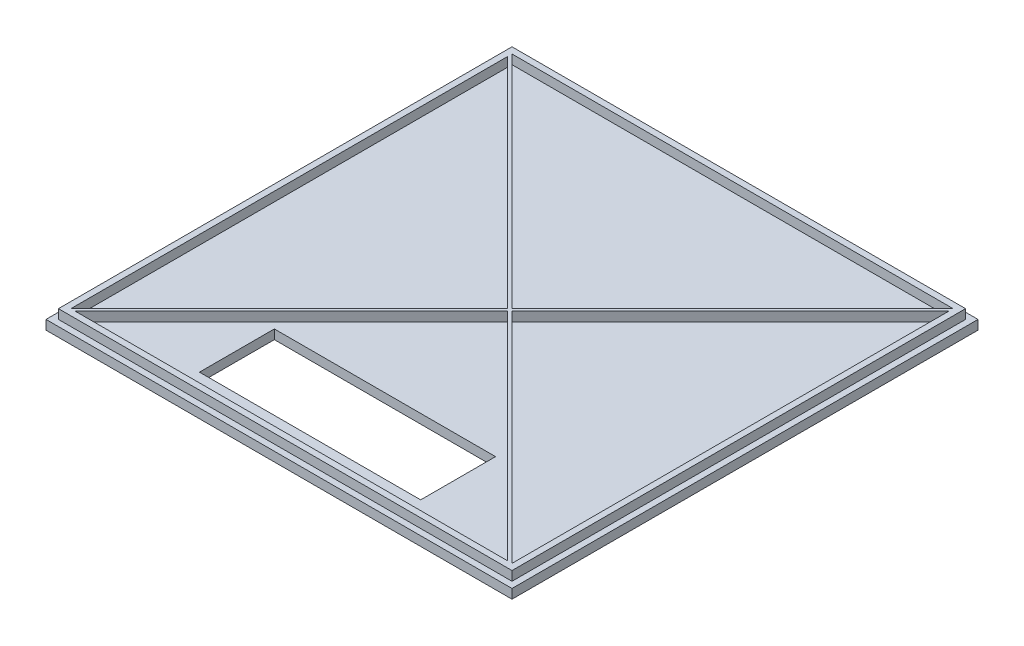
ISO-10303-21;
HEADER;
FILE_DESCRIPTION(('STEP AP214'),'2;1');
FILE_NAME('part.step','',(''),(''),'','','');
FILE_SCHEMA(('AUTOMOTIVE_DESIGN { 1 0 10303 214 1 1 1 1 }'));
ENDSEC;
DATA;
#1=APPLICATION_CONTEXT('core data for automotive mechanical design processes');
#2=APPLICATION_PROTOCOL_DEFINITION('international standard','automotive_design',2000,#1);
#3=PRODUCT_CONTEXT('',#1,'mechanical');
#4=PRODUCT('Part','Part','',(#3));
#5=PRODUCT_RELATED_PRODUCT_CATEGORY('part','',(#4));
#6=PRODUCT_DEFINITION_FORMATION('','',#4);
#7=PRODUCT_DEFINITION_CONTEXT('part definition',#1,'design');
#8=PRODUCT_DEFINITION('design','',#6,#7);
#9=PRODUCT_DEFINITION_SHAPE('','',#8);
#10=(LENGTH_UNIT() NAMED_UNIT(*) SI_UNIT(.MILLI.,.METRE.));
#11=(NAMED_UNIT(*) PLANE_ANGLE_UNIT() SI_UNIT($,.RADIAN.));
#12=(NAMED_UNIT(*) SI_UNIT($,.STERADIAN.) SOLID_ANGLE_UNIT());
#13=UNCERTAINTY_MEASURE_WITH_UNIT(LENGTH_MEASURE(1.E-05),#10,'distance_accuracy_value','');
#14=(GEOMETRIC_REPRESENTATION_CONTEXT(3) GLOBAL_UNCERTAINTY_ASSIGNED_CONTEXT((#13)) GLOBAL_UNIT_ASSIGNED_CONTEXT((#10,
#11,#12)) REPRESENTATION_CONTEXT('',''));
#15=CARTESIAN_POINT('',(0.,0.,0.));
#16=DIRECTION('',(0.,0.,1.));
#17=DIRECTION('',(1.,0.,0.));
#18=AXIS2_PLACEMENT_3D('',#15,#16,#17);
#19=CARTESIAN_POINT('',(71.,203.818325856979,-71.));
#20=DIRECTION('',(-1.,0.,0.));
#21=DIRECTION('',(0.,0.,1.));
#22=AXIS2_PLACEMENT_3D('',#19,#20,#21);
#23=PLANE('',#22);
#24=DIRECTION('',(0.,0.,-1.));
#25=VECTOR('',#24,1.);
#26=CARTESIAN_POINT('',(71.,3.,-71.));
#27=LINE('',#26,#25);
#28=CARTESIAN_POINT('',(71.,3.,71.));
#29=VERTEX_POINT('',#28);
#30=CARTESIAN_POINT('',(71.,3.,-69.5857864376269));
#31=VERTEX_POINT('',#30);
#32=EDGE_CURVE('E327',#29,#31,#27,.T.);
#33=ORIENTED_EDGE('',*,*,#32,.T.);
#34=DIRECTION('',(0.,-1.,0.));
#35=VECTOR('',#34,1.);
#36=CARTESIAN_POINT('',(71.,203.818325856979,-69.5857864376269));
#37=LINE('',#36,#35);
#38=CARTESIAN_POINT('',(71.,0.,-69.5857864376269));
#39=VERTEX_POINT('',#38);
#40=EDGE_CURVE('E291',#31,#39,#37,.T.);
#41=ORIENTED_EDGE('',*,*,#40,.T.);
#42=DIRECTION('',(0.,0.,-1.));
#43=VECTOR('',#42,1.);
#44=CARTESIAN_POINT('',(71.,0.,-71.));
#45=LINE('',#44,#43);
#46=CARTESIAN_POINT('',(71.,0.,71.));
#47=VERTEX_POINT('',#46);
#48=EDGE_CURVE('E317',#47,#39,#45,.T.);
#49=ORIENTED_EDGE('',*,*,#48,.F.);
#50=DIRECTION('',(0.,-1.,0.));
#51=VECTOR('',#50,1.);
#52=CARTESIAN_POINT('',(71.,203.818325856979,71.));
#53=LINE('',#52,#51);
#54=EDGE_CURVE('E303',#29,#47,#53,.T.);
#55=ORIENTED_EDGE('',*,*,#54,.F.);
#56=EDGE_LOOP('',(#33,#41,#49,#55));
#57=FACE_BOUND('',#56,.T.);
#58=ADVANCED_FACE('F59',(#57),#23,.T.);
#59=CARTESIAN_POINT('',(-71.,203.818325856979,-71.));
#60=DIRECTION('',(1.,0.,0.));
#61=DIRECTION('',(0.,0.,-1.));
#62=AXIS2_PLACEMENT_3D('',#59,#60,#61);
#63=PLANE('',#62);
#64=DIRECTION('',(0.,0.,1.));
#65=VECTOR('',#64,1.);
#66=CARTESIAN_POINT('',(-71.,0.,-71.));
#67=LINE('',#66,#65);
#68=CARTESIAN_POINT('',(-71.,0.,-69.5857864376269));
#69=VERTEX_POINT('',#68);
#70=CARTESIAN_POINT('',(-71.,0.,71.));
#71=VERTEX_POINT('',#70);
#72=EDGE_CURVE('E309',#69,#71,#67,.T.);
#73=ORIENTED_EDGE('',*,*,#72,.F.);
#74=DIRECTION('',(0.,1.,0.));
#75=VECTOR('',#74,1.);
#76=CARTESIAN_POINT('',(-71.,203.818325856979,-69.5857864376269));
#77=LINE('',#76,#75);
#78=CARTESIAN_POINT('',(-71.,3.,-69.5857864376269));
#79=VERTEX_POINT('',#78);
#80=EDGE_CURVE('E297',#69,#79,#77,.T.);
#81=ORIENTED_EDGE('',*,*,#80,.T.);
#82=DIRECTION('',(0.,0.,1.));
#83=VECTOR('',#82,1.);
#84=CARTESIAN_POINT('',(-71.,3.,-71.));
#85=LINE('',#84,#83);
#86=CARTESIAN_POINT('',(-71.,3.00000000000006,71.));
#87=VERTEX_POINT('',#86);
#88=EDGE_CURVE('E320',#79,#87,#85,.T.);
#89=ORIENTED_EDGE('',*,*,#88,.T.);
#90=DIRECTION('',(0.,-1.,0.));
#91=VECTOR('',#90,1.);
#92=CARTESIAN_POINT('',(-71.,203.818325856979,71.));
#93=LINE('',#92,#91);
#94=EDGE_CURVE('E308',#87,#71,#93,.T.);
#95=ORIENTED_EDGE('',*,*,#94,.T.);
#96=EDGE_LOOP('',(#73,#81,#89,#95));
#97=FACE_BOUND('',#96,.T.);
#98=ADVANCED_FACE('F432',(#97),#63,.T.);
#99=CARTESIAN_POINT('',(-71.,203.818325856979,71.));
#100=DIRECTION('',(0.,0.,-1.));
#101=DIRECTION('',(-1.,0.,0.));
#102=AXIS2_PLACEMENT_3D('',#99,#100,#101);
#103=PLANE('',#102);
#104=DIRECTION('',(1.,0.,0.));
#105=VECTOR('',#104,1.);
#106=CARTESIAN_POINT('',(-71.,3.,71.));
#107=LINE('',#106,#105);
#108=CARTESIAN_POINT('',(-69.5857864376269,3.,71.));
#109=VERTEX_POINT('',#108);
#110=CARTESIAN_POINT('',(69.5857864376269,3.,71.));
#111=VERTEX_POINT('',#110);
#112=EDGE_CURVE('E307',#109,#111,#107,.T.);
#113=ORIENTED_EDGE('',*,*,#112,.T.);
#114=DIRECTION('',(0.,-1.,0.));
#115=VECTOR('',#114,1.);
#116=CARTESIAN_POINT('',(69.5857864376269,203.818325856979,71.));
#117=LINE('',#116,#115);
#118=CARTESIAN_POINT('',(69.5857864376269,0.,71.));
#119=VERTEX_POINT('',#118);
#120=EDGE_CURVE('E300',#111,#119,#117,.T.);
#121=ORIENTED_EDGE('',*,*,#120,.T.);
#122=DIRECTION('',(1.,0.,0.));
#123=VECTOR('',#122,1.);
#124=CARTESIAN_POINT('',(-71.,0.,71.));
#125=LINE('',#124,#123);
#126=CARTESIAN_POINT('',(-69.5857864376269,0.,71.));
#127=VERTEX_POINT('',#126);
#128=EDGE_CURVE('E304',#127,#119,#125,.T.);
#129=ORIENTED_EDGE('',*,*,#128,.F.);
#130=DIRECTION('',(0.,1.,0.));
#131=VECTOR('',#130,1.);
#132=CARTESIAN_POINT('',(-69.5857864376269,203.818325856979,71.));
#133=LINE('',#132,#131);
#134=EDGE_CURVE('E294',#127,#109,#133,.T.);
#135=ORIENTED_EDGE('',*,*,#134,.T.);
#136=EDGE_LOOP('',(#113,#121,#129,#135));
#137=FACE_BOUND('',#136,.T.);
#138=ADVANCED_FACE('F405',(#137),#103,.T.);
#139=CARTESIAN_POINT('',(0.,0.,0.));
#140=DIRECTION('',(0.,1.,0.));
#141=DIRECTION('',(0.,0.,1.));
#142=AXIS2_PLACEMENT_3D('',#139,#140,#141);
#143=PLANE('',#142);
#144=DIRECTION('',(0.707106781186547,0.,-0.707106781186548));
#145=VECTOR('',#144,1.);
#146=CARTESIAN_POINT('',(-71.,0.,71.));
#147=LINE('',#146,#145);
#148=CARTESIAN_POINT('',(-0.707106781186531,0.,0.707106781186573));
#149=VERTEX_POINT('',#148);
#150=EDGE_CURVE('E255',#71,#149,#147,.T.);
#151=ORIENTED_EDGE('',*,*,#150,.T.);
#152=DIRECTION('',(-0.707106781186548,0.,-0.707106781186548));
#153=VECTOR('',#152,1.);
#154=CARTESIAN_POINT('',(-0.707106781186553,0.,0.707106781186553));
#155=LINE('',#154,#153);
#156=EDGE_CURVE('E12',#149,#69,#155,.T.);
#157=ORIENTED_EDGE('',*,*,#156,.T.);
#158=ORIENTED_EDGE('',*,*,#72,.T.);
#159=EDGE_LOOP('',(#151,#157,#158));
#160=FACE_BOUND('',#159,.T.);
#161=ADVANCED_FACE('F559',(#160),#143,.T.);
#162=DIRECTION('',(0.,0.,-1.));
#163=VECTOR('',#162,1.);
#164=CARTESIAN_POINT('',(35.5999999999999,0.,0.));
#165=LINE('',#164,#163);
#166=CARTESIAN_POINT('',(35.5999999999999,0.,65.));
#167=VERTEX_POINT('',#166);
#168=CARTESIAN_POINT('',(35.5999999999999,0.,40.9));
#169=VERTEX_POINT('',#168);
#170=EDGE_CURVE('E230',#167,#169,#165,.T.);
#171=ORIENTED_EDGE('',*,*,#170,.F.);
#172=DIRECTION('',(1.,0.,0.));
#173=VECTOR('',#172,1.);
#174=CARTESIAN_POINT('',(0.,0.,65.));
#175=LINE('',#174,#173);
#176=CARTESIAN_POINT('',(-35.6000000000001,0.,65.));
#177=VERTEX_POINT('',#176);
#178=EDGE_CURVE('E251',#177,#167,#175,.T.);
#179=ORIENTED_EDGE('',*,*,#178,.F.);
#180=DIRECTION('',(0.,0.,1.));
#181=VECTOR('',#180,1.);
#182=CARTESIAN_POINT('',(-35.6000000000001,0.,0.));
#183=LINE('',#182,#181);
#184=CARTESIAN_POINT('',(-35.6000000000001,0.,40.9));
#185=VERTEX_POINT('',#184);
#186=EDGE_CURVE('E249',#185,#177,#183,.T.);
#187=ORIENTED_EDGE('',*,*,#186,.F.);
#188=DIRECTION('',(-1.,0.,0.));
#189=VECTOR('',#188,1.);
#190=CARTESIAN_POINT('',(0.,0.,40.9));
#191=LINE('',#190,#189);
#192=EDGE_CURVE('E222',#169,#185,#191,.T.);
#193=ORIENTED_EDGE('',*,*,#192,.F.);
#194=EDGE_LOOP('',(#171,#179,#187,#193));
#195=FACE_BOUND('',#194,.T.);
#196=ORIENTED_EDGE('',*,*,#128,.T.);
#197=DIRECTION('',(0.707106781186548,0.,0.707106781186548));
#198=VECTOR('',#197,1.);
#199=CARTESIAN_POINT('',(-71.7071067811866,0.,-70.2928932188134));
#200=LINE('',#199,#198);
#201=CARTESIAN_POINT('',(0.,0.,1.4142135623731));
#202=VERTEX_POINT('',#201);
#203=EDGE_CURVE('E278',#202,#119,#200,.T.);
#204=ORIENTED_EDGE('',*,*,#203,.F.);
#205=DIRECTION('',(-0.707106781186547,0.,0.707106781186548));
#206=VECTOR('',#205,1.);
#207=CARTESIAN_POINT('',(0.707106781186538,0.,0.707106781186538));
#208=LINE('',#207,#206);
#209=EDGE_CURVE('E67',#202,#127,#208,.T.);
#210=ORIENTED_EDGE('',*,*,#209,.T.);
#211=EDGE_LOOP('',(#196,#204,#210));
#212=FACE_BOUND('',#211,.T.);
#213=ADVANCED_FACE('F401',(#195,#212),#143,.T.);
#214=DIRECTION('',(0.707106781186548,0.,0.707106781186548));
#215=VECTOR('',#214,1.);
#216=CARTESIAN_POINT('',(-71.,0.,-71.));
#217=LINE('',#216,#215);
#218=CARTESIAN_POINT('',(-71.,0.,-71.));
#219=VERTEX_POINT('',#218);
#220=CARTESIAN_POINT('',(0.,0.,0.));
#221=VERTEX_POINT('',#220);
#222=EDGE_CURVE('E273',#219,#221,#217,.T.);
#223=ORIENTED_EDGE('',*,*,#222,.T.);
#224=CARTESIAN_POINT('',(71.,0.,-71.));
#225=VERTEX_POINT('',#224);
#226=EDGE_CURVE('E259',#221,#225,#147,.T.);
#227=ORIENTED_EDGE('',*,*,#226,.T.);
#228=DIRECTION('',(-1.,0.,0.));
#229=VECTOR('',#228,1.);
#230=CARTESIAN_POINT('',(-71.,0.,-71.));
#231=LINE('',#230,#229);
#232=EDGE_CURVE('E313',#225,#219,#231,.T.);
#233=ORIENTED_EDGE('',*,*,#232,.T.);
#234=EDGE_LOOP('',(#223,#227,#233));
#235=FACE_BOUND('',#234,.T.);
#236=ADVANCED_FACE('F446',(#235),#143,.T.);
#237=CARTESIAN_POINT('',(0.,3.,0.));
#238=DIRECTION('',(0.,1.,0.));
#239=DIRECTION('',(0.,0.,1.));
#240=AXIS2_PLACEMENT_3D('',#237,#238,#239);
#241=PLANE('',#240);
#242=DIRECTION('',(0.707106781186548,0.,0.707106781186548));
#243=VECTOR('',#242,1.);
#244=CARTESIAN_POINT('',(-71.7071067811866,3.,-70.2928932188134));
#245=LINE('',#244,#243);
#246=CARTESIAN_POINT('',(0.,3.,1.4142135623731));
#247=VERTEX_POINT('',#246);
#248=EDGE_CURVE('E272',#247,#111,#245,.T.);
#249=ORIENTED_EDGE('',*,*,#248,.T.);
#250=ORIENTED_EDGE('',*,*,#112,.F.);
#251=DIRECTION('',(0.707106781186547,0.,-0.707106781186548));
#252=VECTOR('',#251,1.);
#253=CARTESIAN_POINT('',(-70.2928932188134,3.,71.7071067811865));
#254=LINE('',#253,#252);
#255=EDGE_CURVE('E264',#109,#247,#254,.T.);
#256=ORIENTED_EDGE('',*,*,#255,.T.);
#257=EDGE_LOOP('',(#249,#250,#256));
#258=FACE_BOUND('',#257,.T.);
#259=ORIENTED_EDGE('',*,*,#32,.F.);
#260=DIRECTION('',(0.707106781186548,0.,0.707106781186548));
#261=VECTOR('',#260,1.);
#262=CARTESIAN_POINT('',(-71.,3.,-71.));
#263=LINE('',#262,#261);
#264=CARTESIAN_POINT('',(0.707106781186559,3.,0.707106781186573));
#265=VERTEX_POINT('',#264);
#266=EDGE_CURVE('E276',#265,#29,#263,.T.);
#267=ORIENTED_EDGE('',*,*,#266,.F.);
#268=EDGE_CURVE('E254',#265,#31,#254,.T.);
#269=ORIENTED_EDGE('',*,*,#268,.T.);
#270=EDGE_LOOP('',(#259,#267,#269));
#271=FACE_BOUND('',#270,.T.);
#272=CARTESIAN_POINT('',(-71.,3.00000000000006,-71.));
#273=VERTEX_POINT('',#272);
#274=CARTESIAN_POINT('',(0.,3.,0.));
#275=VERTEX_POINT('',#274);
#276=EDGE_CURVE('E281',#273,#275,#263,.T.);
#277=ORIENTED_EDGE('',*,*,#276,.F.);
#278=DIRECTION('',(-1.,0.,0.));
#279=VECTOR('',#278,1.);
#280=CARTESIAN_POINT('',(-71.,3.,-71.));
#281=LINE('',#280,#279);
#282=CARTESIAN_POINT('',(71.,3.,-71.));
#283=VERTEX_POINT('',#282);
#284=EDGE_CURVE('E324',#283,#273,#281,.T.);
#285=ORIENTED_EDGE('',*,*,#284,.F.);
#286=DIRECTION('',(0.707106781186547,0.,-0.707106781186548));
#287=VECTOR('',#286,1.);
#288=CARTESIAN_POINT('',(-71.,3.,71.));
#289=LINE('',#288,#287);
#290=EDGE_CURVE('E258',#275,#283,#289,.T.);
#291=ORIENTED_EDGE('',*,*,#290,.F.);
#292=EDGE_LOOP('',(#277,#285,#291));
#293=FACE_BOUND('',#292,.T.);
#294=CARTESIAN_POINT('',(-0.707106781186531,3.,0.707106781186573));
#295=VERTEX_POINT('',#294);
#296=EDGE_CURVE('E263',#87,#295,#289,.T.);
#297=ORIENTED_EDGE('',*,*,#296,.F.);
#298=ORIENTED_EDGE('',*,*,#88,.F.);
#299=EDGE_CURVE('E282',#79,#295,#245,.T.);
#300=ORIENTED_EDGE('',*,*,#299,.T.);
#301=EDGE_LOOP('',(#297,#298,#300));
#302=FACE_BOUND('',#301,.T.);
#303=DIRECTION('',(0.,0.,-1.));
#304=VECTOR('',#303,1.);
#305=CARTESIAN_POINT('',(73.,3.,-73.));
#306=LINE('',#305,#304);
#307=CARTESIAN_POINT('',(73.,3.,73.));
#308=VERTEX_POINT('',#307);
#309=CARTESIAN_POINT('',(73.,3.,-73.));
#310=VERTEX_POINT('',#309);
#311=EDGE_CURVE('E338',#308,#310,#306,.T.);
#312=ORIENTED_EDGE('',*,*,#311,.T.);
#313=DIRECTION('',(-1.,0.,0.));
#314=VECTOR('',#313,1.);
#315=CARTESIAN_POINT('',(-73.,3.,-73.));
#316=LINE('',#315,#314);
#317=CARTESIAN_POINT('',(-73.,3.,-73.));
#318=VERTEX_POINT('',#317);
#319=EDGE_CURVE('E341',#310,#318,#316,.T.);
#320=ORIENTED_EDGE('',*,*,#319,.T.);
#321=DIRECTION('',(0.,0.,1.));
#322=VECTOR('',#321,1.);
#323=CARTESIAN_POINT('',(-73.,3.,-73.));
#324=LINE('',#323,#322);
#325=CARTESIAN_POINT('',(-73.,3.,73.));
#326=VERTEX_POINT('',#325);
#327=EDGE_CURVE('E344',#318,#326,#324,.T.);
#328=ORIENTED_EDGE('',*,*,#327,.T.);
#329=DIRECTION('',(1.,0.,0.));
#330=VECTOR('',#329,1.);
#331=CARTESIAN_POINT('',(-73.,3.,73.));
#332=LINE('',#331,#330);
#333=EDGE_CURVE('E346',#326,#308,#332,.T.);
#334=ORIENTED_EDGE('',*,*,#333,.T.);
#335=EDGE_LOOP('',(#312,#320,#328,#334));
#336=FACE_BOUND('',#335,.T.);
#337=ADVANCED_FACE('F412',(#258,#271,#293,#302,#336),#241,.T.);
#338=CARTESIAN_POINT('',(0.,0.,0.));
#339=DIRECTION('',(0.,1.,0.));
#340=DIRECTION('',(0.,0.,1.));
#341=AXIS2_PLACEMENT_3D('',#338,#339,#340);
#342=PLANE('',#341);
#343=DIRECTION('',(0.,0.,-1.));
#344=VECTOR('',#343,1.);
#345=CARTESIAN_POINT('',(74.9999999999999,0.,-75.));
#346=LINE('',#345,#344);
#347=CARTESIAN_POINT('',(74.9999999999999,0.,75.));
#348=VERTEX_POINT('',#347);
#349=CARTESIAN_POINT('',(74.9999999999999,0.,-75.));
#350=VERTEX_POINT('',#349);
#351=EDGE_CURVE('E366',#348,#350,#346,.T.);
#352=ORIENTED_EDGE('',*,*,#351,.T.);
#353=DIRECTION('',(-1.,0.,0.));
#354=VECTOR('',#353,1.);
#355=CARTESIAN_POINT('',(-75.0000000000001,0.,-75.));
#356=LINE('',#355,#354);
#357=CARTESIAN_POINT('',(-75.0000000000001,0.,-75.));
#358=VERTEX_POINT('',#357);
#359=EDGE_CURVE('E383',#350,#358,#356,.T.);
#360=ORIENTED_EDGE('',*,*,#359,.T.);
#361=DIRECTION('',(0.,0.,1.));
#362=VECTOR('',#361,1.);
#363=CARTESIAN_POINT('',(-75.0000000000001,0.,-75.));
#364=LINE('',#363,#362);
#365=CARTESIAN_POINT('',(-75.,0.,75.));
#366=VERTEX_POINT('',#365);
#367=EDGE_CURVE('E386',#358,#366,#364,.T.);
#368=ORIENTED_EDGE('',*,*,#367,.T.);
#369=DIRECTION('',(1.,0.,0.));
#370=VECTOR('',#369,1.);
#371=CARTESIAN_POINT('',(-75.,0.,75.));
#372=LINE('',#371,#370);
#373=EDGE_CURVE('E371',#366,#348,#372,.T.);
#374=ORIENTED_EDGE('',*,*,#373,.T.);
#375=EDGE_LOOP('',(#352,#360,#368,#374));
#376=FACE_BOUND('',#375,.T.);
#377=DIRECTION('',(-1.,0.,0.));
#378=VECTOR('',#377,1.);
#379=CARTESIAN_POINT('',(-73.,0.,-73.));
#380=LINE('',#379,#378);
#381=CARTESIAN_POINT('',(73.,0.,-73.));
#382=VERTEX_POINT('',#381);
#383=CARTESIAN_POINT('',(-73.,0.,-73.));
#384=VERTEX_POINT('',#383);
#385=EDGE_CURVE('E351',#382,#384,#380,.T.);
#386=ORIENTED_EDGE('',*,*,#385,.F.);
#387=DIRECTION('',(0.,0.,-1.));
#388=VECTOR('',#387,1.);
#389=CARTESIAN_POINT('',(73.,0.,-73.));
#390=LINE('',#389,#388);
#391=CARTESIAN_POINT('',(73.,0.,73.));
#392=VERTEX_POINT('',#391);
#393=EDGE_CURVE('E323',#392,#382,#390,.T.);
#394=ORIENTED_EDGE('',*,*,#393,.F.);
#395=DIRECTION('',(1.,0.,0.));
#396=VECTOR('',#395,1.);
#397=CARTESIAN_POINT('',(-73.,0.,73.));
#398=LINE('',#397,#396);
#399=CARTESIAN_POINT('',(-73.,0.,73.));
#400=VERTEX_POINT('',#399);
#401=EDGE_CURVE('E342',#400,#392,#398,.T.);
#402=ORIENTED_EDGE('',*,*,#401,.F.);
#403=DIRECTION('',(0.,0.,1.));
#404=VECTOR('',#403,1.);
#405=CARTESIAN_POINT('',(-73.,0.,-73.));
#406=LINE('',#405,#404);
#407=EDGE_CURVE('E353',#384,#400,#406,.T.);
#408=ORIENTED_EDGE('',*,*,#407,.F.);
#409=EDGE_LOOP('',(#386,#394,#402,#408));
#410=FACE_BOUND('',#409,.T.);
#411=ADVANCED_FACE('F445',(#376,#410),#342,.T.);
#412=CARTESIAN_POINT('',(74.9999999999999,-3.,-75.));
#413=DIRECTION('',(1.,0.,0.));
#414=DIRECTION('',(0.,0.,-1.));
#415=AXIS2_PLACEMENT_3D('',#412,#413,#414);
#416=PLANE('',#415);
#417=ORIENTED_EDGE('',*,*,#351,.F.);
#418=DIRECTION('',(0.,1.,0.));
#419=VECTOR('',#418,1.);
#420=CARTESIAN_POINT('',(74.9999999999999,-3.,75.));
#421=LINE('',#420,#419);
#422=CARTESIAN_POINT('',(74.9999999999999,-3.,75.));
#423=VERTEX_POINT('',#422);
#424=EDGE_CURVE('E391',#423,#348,#421,.T.);
#425=ORIENTED_EDGE('',*,*,#424,.F.);
#426=DIRECTION('',(0.,0.,-1.));
#427=VECTOR('',#426,1.);
#428=CARTESIAN_POINT('',(74.9999999999999,-3.,-75.));
#429=LINE('',#428,#427);
#430=CARTESIAN_POINT('',(74.9999999999999,-3.,-75.));
#431=VERTEX_POINT('',#430);
#432=EDGE_CURVE('E367',#423,#431,#429,.T.);
#433=ORIENTED_EDGE('',*,*,#432,.T.);
#434=DIRECTION('',(0.,1.,0.));
#435=VECTOR('',#434,1.);
#436=CARTESIAN_POINT('',(74.9999999999999,-3.,-75.));
#437=LINE('',#436,#435);
#438=EDGE_CURVE('E380',#431,#350,#437,.T.);
#439=ORIENTED_EDGE('',*,*,#438,.T.);
#440=EDGE_LOOP('',(#417,#425,#433,#439));
#441=FACE_BOUND('',#440,.T.);
#442=ADVANCED_FACE('F61',(#441),#416,.T.);
#443=CARTESIAN_POINT('',(-75.,-3.,75.));
#444=DIRECTION('',(0.,0.,1.));
#445=DIRECTION('',(1.,0.,0.));
#446=AXIS2_PLACEMENT_3D('',#443,#444,#445);
#447=PLANE('',#446);
#448=ORIENTED_EDGE('',*,*,#373,.F.);
#449=DIRECTION('',(0.,1.,0.));
#450=VECTOR('',#449,1.);
#451=CARTESIAN_POINT('',(-75.,-3.,75.));
#452=LINE('',#451,#450);
#453=CARTESIAN_POINT('',(-75.,-3.,75.));
#454=VERTEX_POINT('',#453);
#455=EDGE_CURVE('E393',#454,#366,#452,.T.);
#456=ORIENTED_EDGE('',*,*,#455,.F.);
#457=DIRECTION('',(1.,0.,0.));
#458=VECTOR('',#457,1.);
#459=CARTESIAN_POINT('',(-75.,-3.,75.));
#460=LINE('',#459,#458);
#461=EDGE_CURVE('E377',#454,#423,#460,.T.);
#462=ORIENTED_EDGE('',*,*,#461,.T.);
#463=ORIENTED_EDGE('',*,*,#424,.T.);
#464=EDGE_LOOP('',(#448,#456,#462,#463));
#465=FACE_BOUND('',#464,.T.);
#466=ADVANCED_FACE('F469',(#465),#447,.T.);
#467=CARTESIAN_POINT('',(-75.0000000000001,-3.,-75.));
#468=DIRECTION('',(-1.,0.,0.));
#469=DIRECTION('',(0.,0.,1.));
#470=AXIS2_PLACEMENT_3D('',#467,#468,#469);
#471=PLANE('',#470);
#472=ORIENTED_EDGE('',*,*,#367,.F.);
#473=DIRECTION('',(0.,1.,0.));
#474=VECTOR('',#473,1.);
#475=CARTESIAN_POINT('',(-75.0000000000001,-3.,-75.));
#476=LINE('',#475,#474);
#477=CARTESIAN_POINT('',(-75.0000000000001,-3.,-75.));
#478=VERTEX_POINT('',#477);
#479=EDGE_CURVE('E395',#478,#358,#476,.T.);
#480=ORIENTED_EDGE('',*,*,#479,.F.);
#481=DIRECTION('',(0.,0.,1.));
#482=VECTOR('',#481,1.);
#483=CARTESIAN_POINT('',(-75.0000000000001,-3.,-75.));
#484=LINE('',#483,#482);
#485=EDGE_CURVE('E374',#478,#454,#484,.T.);
#486=ORIENTED_EDGE('',*,*,#485,.T.);
#487=ORIENTED_EDGE('',*,*,#455,.T.);
#488=EDGE_LOOP('',(#472,#480,#486,#487));
#489=FACE_BOUND('',#488,.T.);
#490=ADVANCED_FACE('F472',(#489),#471,.T.);
#491=CARTESIAN_POINT('',(-75.0000000000001,-3.,-75.));
#492=DIRECTION('',(0.,0.,-1.));
#493=DIRECTION('',(-1.,0.,0.));
#494=AXIS2_PLACEMENT_3D('',#491,#492,#493);
#495=PLANE('',#494);
#496=ORIENTED_EDGE('',*,*,#359,.F.);
#497=ORIENTED_EDGE('',*,*,#438,.F.);
#498=DIRECTION('',(-1.,0.,0.));
#499=VECTOR('',#498,1.);
#500=CARTESIAN_POINT('',(-75.0000000000001,-3.,-75.));
#501=LINE('',#500,#499);
#502=EDGE_CURVE('E370',#431,#478,#501,.T.);
#503=ORIENTED_EDGE('',*,*,#502,.T.);
#504=ORIENTED_EDGE('',*,*,#479,.T.);
#505=EDGE_LOOP('',(#496,#497,#503,#504));
#506=FACE_BOUND('',#505,.T.);
#507=ADVANCED_FACE('F465',(#506),#495,.T.);
#508=CARTESIAN_POINT('',(0.,-3.,0.));
#509=DIRECTION('',(0.,1.,0.));
#510=DIRECTION('',(0.,0.,1.));
#511=AXIS2_PLACEMENT_3D('',#508,#509,#510);
#512=PLANE('',#511);
#513=DIRECTION('',(-1.,0.,0.));
#514=VECTOR('',#513,1.);
#515=CARTESIAN_POINT('',(-35.6000000000001,-3.,65.));
#516=LINE('',#515,#514);
#517=CARTESIAN_POINT('',(35.5999999999999,-3.,65.));
#518=VERTEX_POINT('',#517);
#519=CARTESIAN_POINT('',(-35.6000000000001,-3.,65.));
#520=VERTEX_POINT('',#519);
#521=EDGE_CURVE('E236',#518,#520,#516,.T.);
#522=ORIENTED_EDGE('',*,*,#521,.F.);
#523=DIRECTION('',(0.,0.,1.));
#524=VECTOR('',#523,1.);
#525=CARTESIAN_POINT('',(35.5999999999999,-3.,65.));
#526=LINE('',#525,#524);
#527=CARTESIAN_POINT('',(35.5999999999999,-3.,40.9));
#528=VERTEX_POINT('',#527);
#529=EDGE_CURVE('E223',#528,#518,#526,.T.);
#530=ORIENTED_EDGE('',*,*,#529,.F.);
#531=DIRECTION('',(1.,0.,0.));
#532=VECTOR('',#531,1.);
#533=CARTESIAN_POINT('',(-35.6000000000001,-3.,40.9));
#534=LINE('',#533,#532);
#535=CARTESIAN_POINT('',(-35.6000000000001,-3.,40.9));
#536=VERTEX_POINT('',#535);
#537=EDGE_CURVE('E217',#536,#528,#534,.T.);
#538=ORIENTED_EDGE('',*,*,#537,.F.);
#539=DIRECTION('',(0.,0.,-1.));
#540=VECTOR('',#539,1.);
#541=CARTESIAN_POINT('',(-35.6000000000001,-3.,65.));
#542=LINE('',#541,#540);
#543=EDGE_CURVE('E238',#520,#536,#542,.T.);
#544=ORIENTED_EDGE('',*,*,#543,.F.);
#545=EDGE_LOOP('',(#522,#530,#538,#544));
#546=FACE_BOUND('',#545,.T.);
#547=ORIENTED_EDGE('',*,*,#432,.F.);
#548=ORIENTED_EDGE('',*,*,#461,.F.);
#549=ORIENTED_EDGE('',*,*,#485,.F.);
#550=ORIENTED_EDGE('',*,*,#502,.F.);
#551=EDGE_LOOP('',(#547,#548,#549,#550));
#552=FACE_BOUND('',#551,.T.);
#553=ADVANCED_FACE('F234',(#546,#552),#512,.F.);
#554=CARTESIAN_POINT('',(73.,3.,-73.));
#555=DIRECTION('',(-1.,0.,0.));
#556=DIRECTION('',(0.,0.,1.));
#557=AXIS2_PLACEMENT_3D('',#554,#555,#556);
#558=PLANE('',#557);
#559=ORIENTED_EDGE('',*,*,#393,.T.);
#560=DIRECTION('',(0.,-1.,0.));
#561=VECTOR('',#560,1.);
#562=CARTESIAN_POINT('',(73.,3.,-73.));
#563=LINE('',#562,#561);
#564=EDGE_CURVE('E364',#310,#382,#563,.T.);
#565=ORIENTED_EDGE('',*,*,#564,.F.);
#566=ORIENTED_EDGE('',*,*,#311,.F.);
#567=DIRECTION('',(0.,-1.,0.));
#568=VECTOR('',#567,1.);
#569=CARTESIAN_POINT('',(73.,3.,73.));
#570=LINE('',#569,#568);
#571=EDGE_CURVE('E348',#308,#392,#570,.T.);
#572=ORIENTED_EDGE('',*,*,#571,.T.);
#573=EDGE_LOOP('',(#559,#565,#566,#572));
#574=FACE_BOUND('',#573,.T.);
#575=ADVANCED_FACE('F458',(#574),#558,.F.);
#576=CARTESIAN_POINT('',(-73.,3.,-73.));
#577=DIRECTION('',(0.,0.,1.));
#578=DIRECTION('',(1.,0.,0.));
#579=AXIS2_PLACEMENT_3D('',#576,#577,#578);
#580=PLANE('',#579);
#581=ORIENTED_EDGE('',*,*,#385,.T.);
#582=DIRECTION('',(0.,-1.,0.));
#583=VECTOR('',#582,1.);
#584=CARTESIAN_POINT('',(-73.,3.,-73.));
#585=LINE('',#584,#583);
#586=EDGE_CURVE('E361',#318,#384,#585,.T.);
#587=ORIENTED_EDGE('',*,*,#586,.F.);
#588=ORIENTED_EDGE('',*,*,#319,.F.);
#589=ORIENTED_EDGE('',*,*,#564,.T.);
#590=EDGE_LOOP('',(#581,#587,#588,#589));
#591=FACE_BOUND('',#590,.T.);
#592=ADVANCED_FACE('F454',(#591),#580,.F.);
#593=CARTESIAN_POINT('',(-73.,3.,-73.));
#594=DIRECTION('',(1.,0.,0.));
#595=DIRECTION('',(0.,0.,-1.));
#596=AXIS2_PLACEMENT_3D('',#593,#594,#595);
#597=PLANE('',#596);
#598=ORIENTED_EDGE('',*,*,#407,.T.);
#599=DIRECTION('',(0.,-1.,0.));
#600=VECTOR('',#599,1.);
#601=CARTESIAN_POINT('',(-73.,3.,73.));
#602=LINE('',#601,#600);
#603=EDGE_CURVE('E359',#326,#400,#602,.T.);
#604=ORIENTED_EDGE('',*,*,#603,.F.);
#605=ORIENTED_EDGE('',*,*,#327,.F.);
#606=ORIENTED_EDGE('',*,*,#586,.T.);
#607=EDGE_LOOP('',(#598,#604,#605,#606));
#608=FACE_BOUND('',#607,.T.);
#609=ADVANCED_FACE('F450',(#608),#597,.F.);
#610=CARTESIAN_POINT('',(-73.,3.,73.));
#611=DIRECTION('',(0.,0.,-1.));
#612=DIRECTION('',(-1.,0.,0.));
#613=AXIS2_PLACEMENT_3D('',#610,#611,#612);
#614=PLANE('',#613);
#615=ORIENTED_EDGE('',*,*,#401,.T.);
#616=ORIENTED_EDGE('',*,*,#571,.F.);
#617=ORIENTED_EDGE('',*,*,#333,.F.);
#618=ORIENTED_EDGE('',*,*,#603,.T.);
#619=EDGE_LOOP('',(#615,#616,#617,#618));
#620=FACE_BOUND('',#619,.T.);
#621=ADVANCED_FACE('F447',(#620),#614,.F.);
#622=CARTESIAN_POINT('',(-71.,203.818325856979,-71.));
#623=DIRECTION('',(0.,0.,1.));
#624=DIRECTION('',(1.,0.,0.));
#625=AXIS2_PLACEMENT_3D('',#622,#623,#624);
#626=PLANE('',#625);
#627=ORIENTED_EDGE('',*,*,#284,.T.);
#628=DIRECTION('',(0.,-1.,0.));
#629=VECTOR('',#628,1.);
#630=CARTESIAN_POINT('',(-71.,203.818325856979,-71.));
#631=LINE('',#630,#629);
#632=EDGE_CURVE('E312',#273,#219,#631,.T.);
#633=ORIENTED_EDGE('',*,*,#632,.T.);
#634=ORIENTED_EDGE('',*,*,#232,.F.);
#635=DIRECTION('',(0.,-1.,0.));
#636=VECTOR('',#635,1.);
#637=CARTESIAN_POINT('',(71.,203.818325856979,-71.));
#638=LINE('',#637,#636);
#639=EDGE_CURVE('E316',#283,#225,#638,.T.);
#640=ORIENTED_EDGE('',*,*,#639,.F.);
#641=EDGE_LOOP('',(#627,#633,#634,#640));
#642=FACE_BOUND('',#641,.T.);
#643=ADVANCED_FACE('F442',(#642),#626,.T.);
#644=CARTESIAN_POINT('',(0.707106781186532,0.,0.707106781186545));
#645=VERTEX_POINT('',#644);
#646=EDGE_CURVE('E277',#645,#47,#217,.T.);
#647=ORIENTED_EDGE('',*,*,#646,.T.);
#648=ORIENTED_EDGE('',*,*,#48,.T.);
#649=DIRECTION('',(0.707106781186547,0.,-0.707106781186548));
#650=VECTOR('',#649,1.);
#651=CARTESIAN_POINT('',(-70.2928932188134,0.,71.7071067811865));
#652=LINE('',#651,#650);
#653=EDGE_CURVE('E260',#645,#39,#652,.T.);
#654=ORIENTED_EDGE('',*,*,#653,.F.);
#655=EDGE_LOOP('',(#647,#648,#654));
#656=FACE_BOUND('',#655,.T.);
#657=ADVANCED_FACE('F570',(#656),#143,.T.);
#658=CARTESIAN_POINT('',(-71.,204.818325856979,-71.));
#659=DIRECTION('',(0.707106781186548,0.,-0.707106781186548));
#660=DIRECTION('',(-0.707106781186548,0.,-0.707106781186548));
#661=AXIS2_PLACEMENT_3D('',#658,#659,#660);
#662=PLANE('',#661);
#663=ORIENTED_EDGE('',*,*,#646,.F.);
#664=DIRECTION('',(0.,1.,0.));
#665=VECTOR('',#664,1.);
#666=CARTESIAN_POINT('',(0.707106781186545,204.818325856979,0.707106781186559));
#667=LINE('',#666,#665);
#668=EDGE_CURVE('E262',#645,#265,#667,.T.);
#669=ORIENTED_EDGE('',*,*,#668,.T.);
#670=ORIENTED_EDGE('',*,*,#266,.T.);
#671=ORIENTED_EDGE('',*,*,#54,.T.);
#672=EDGE_LOOP('',(#663,#669,#670,#671));
#673=FACE_BOUND('',#672,.T.);
#674=ADVANCED_FACE('F601',(#673),#662,.T.);
#675=CARTESIAN_POINT('',(-71.7071067811866,204.818325856979,-70.2928932188134));
#676=DIRECTION('',(0.707106781186548,0.,-0.707106781186548));
#677=DIRECTION('',(-0.707106781186548,0.,-0.707106781186548));
#678=AXIS2_PLACEMENT_3D('',#675,#676,#677);
#679=PLANE('',#678);
#680=ORIENTED_EDGE('',*,*,#120,.F.);
#681=ORIENTED_EDGE('',*,*,#248,.F.);
#682=DIRECTION('',(0.,1.,0.));
#683=VECTOR('',#682,1.);
#684=CARTESIAN_POINT('',(0.,204.818325856979,1.41421356237309));
#685=LINE('',#684,#683);
#686=EDGE_CURVE('E280',#202,#247,#685,.T.);
#687=ORIENTED_EDGE('',*,*,#686,.F.);
#688=ORIENTED_EDGE('',*,*,#203,.T.);
#689=EDGE_LOOP('',(#680,#681,#687,#688));
#690=FACE_BOUND('',#689,.T.);
#691=ADVANCED_FACE('F410',(#690),#679,.F.);
#692=DIRECTION('',(0.,1.,0.));
#693=VECTOR('',#692,1.);
#694=CARTESIAN_POINT('',(0.,204.818325856979,0.));
#695=LINE('',#694,#693);
#696=EDGE_CURVE('E270',#221,#275,#695,.T.);
#697=ORIENTED_EDGE('',*,*,#696,.F.);
#698=ORIENTED_EDGE('',*,*,#222,.F.);
#699=ORIENTED_EDGE('',*,*,#632,.F.);
#700=ORIENTED_EDGE('',*,*,#276,.T.);
#701=EDGE_LOOP('',(#697,#698,#699,#700));
#702=FACE_BOUND('',#701,.T.);
#703=ADVANCED_FACE('F611',(#702),#662,.T.);
#704=ORIENTED_EDGE('',*,*,#80,.F.);
#705=ORIENTED_EDGE('',*,*,#156,.F.);
#706=DIRECTION('',(0.,1.,0.));
#707=VECTOR('',#706,1.);
#708=CARTESIAN_POINT('',(-0.707106781186545,204.818325856979,0.707106781186559));
#709=LINE('',#708,#707);
#710=EDGE_CURVE('E288',#149,#295,#709,.T.);
#711=ORIENTED_EDGE('',*,*,#710,.T.);
#712=ORIENTED_EDGE('',*,*,#299,.F.);
#713=EDGE_LOOP('',(#704,#705,#711,#712));
#714=FACE_BOUND('',#713,.T.);
#715=ADVANCED_FACE('F426',(#714),#679,.F.);
#716=CARTESIAN_POINT('',(-71.,204.818325856979,71.));
#717=DIRECTION('',(-0.707106781186548,0.,-0.707106781186547));
#718=DIRECTION('',(-0.707106781186547,0.,0.707106781186548));
#719=AXIS2_PLACEMENT_3D('',#716,#717,#718);
#720=PLANE('',#719);
#721=ORIENTED_EDGE('',*,*,#710,.F.);
#722=ORIENTED_EDGE('',*,*,#150,.F.);
#723=ORIENTED_EDGE('',*,*,#94,.F.);
#724=ORIENTED_EDGE('',*,*,#296,.T.);
#725=EDGE_LOOP('',(#721,#722,#723,#724));
#726=FACE_BOUND('',#725,.T.);
#727=ADVANCED_FACE('F417',(#726),#720,.T.);
#728=CARTESIAN_POINT('',(-70.2928932188134,204.818325856979,71.7071067811865));
#729=DIRECTION('',(-0.707106781186548,0.,-0.707106781186547));
#730=DIRECTION('',(-0.707106781186547,0.,0.707106781186548));
#731=AXIS2_PLACEMENT_3D('',#728,#729,#730);
#732=PLANE('',#731);
#733=ORIENTED_EDGE('',*,*,#134,.F.);
#734=ORIENTED_EDGE('',*,*,#209,.F.);
#735=ORIENTED_EDGE('',*,*,#686,.T.);
#736=ORIENTED_EDGE('',*,*,#255,.F.);
#737=EDGE_LOOP('',(#733,#734,#735,#736));
#738=FACE_BOUND('',#737,.T.);
#739=ADVANCED_FACE('F414',(#738),#732,.F.);
#740=ORIENTED_EDGE('',*,*,#226,.F.);
#741=ORIENTED_EDGE('',*,*,#696,.T.);
#742=ORIENTED_EDGE('',*,*,#290,.T.);
#743=ORIENTED_EDGE('',*,*,#639,.T.);
#744=EDGE_LOOP('',(#740,#741,#742,#743));
#745=FACE_BOUND('',#744,.T.);
#746=ADVANCED_FACE('F416',(#745),#720,.T.);
#747=ORIENTED_EDGE('',*,*,#40,.F.);
#748=ORIENTED_EDGE('',*,*,#268,.F.);
#749=ORIENTED_EDGE('',*,*,#668,.F.);
#750=ORIENTED_EDGE('',*,*,#653,.T.);
#751=EDGE_LOOP('',(#747,#748,#749,#750));
#752=FACE_BOUND('',#751,.T.);
#753=ADVANCED_FACE('F419',(#752),#732,.F.);
#754=CARTESIAN_POINT('',(35.5999999999999,-78.1681448487323,65.));
#755=DIRECTION('',(1.,0.,0.));
#756=DIRECTION('',(0.,0.,-1.));
#757=AXIS2_PLACEMENT_3D('',#754,#755,#756);
#758=PLANE('',#757);
#759=ORIENTED_EDGE('',*,*,#170,.T.);
#760=DIRECTION('',(0.,1.,0.));
#761=VECTOR('',#760,1.);
#762=CARTESIAN_POINT('',(35.5999999999999,-78.1681448487323,40.9));
#763=LINE('',#762,#761);
#764=EDGE_CURVE('E74',#528,#169,#763,.T.);
#765=ORIENTED_EDGE('',*,*,#764,.F.);
#766=ORIENTED_EDGE('',*,*,#529,.T.);
#767=DIRECTION('',(0.,1.,0.));
#768=VECTOR('',#767,1.);
#769=CARTESIAN_POINT('',(35.5999999999999,-78.1681448487323,65.));
#770=LINE('',#769,#768);
#771=EDGE_CURVE('E242',#518,#167,#770,.T.);
#772=ORIENTED_EDGE('',*,*,#771,.T.);
#773=EDGE_LOOP('',(#759,#765,#766,#772));
#774=FACE_BOUND('',#773,.T.);
#775=ADVANCED_FACE('F226',(#774),#758,.F.);
#776=CARTESIAN_POINT('',(-35.6000000000001,-78.1681448487323,65.));
#777=DIRECTION('',(0.,0.,1.));
#778=DIRECTION('',(1.,0.,0.));
#779=AXIS2_PLACEMENT_3D('',#776,#777,#778);
#780=PLANE('',#779);
#781=ORIENTED_EDGE('',*,*,#178,.T.);
#782=ORIENTED_EDGE('',*,*,#771,.F.);
#783=ORIENTED_EDGE('',*,*,#521,.T.);
#784=DIRECTION('',(0.,1.,0.));
#785=VECTOR('',#784,1.);
#786=CARTESIAN_POINT('',(-35.6000000000001,-78.1681448487323,65.));
#787=LINE('',#786,#785);
#788=EDGE_CURVE('E244',#520,#177,#787,.T.);
#789=ORIENTED_EDGE('',*,*,#788,.T.);
#790=EDGE_LOOP('',(#781,#782,#783,#789));
#791=FACE_BOUND('',#790,.T.);
#792=ADVANCED_FACE('F671',(#791),#780,.F.);
#793=CARTESIAN_POINT('',(-35.6000000000001,-78.1681448487323,65.));
#794=DIRECTION('',(-1.,0.,0.));
#795=DIRECTION('',(0.,0.,1.));
#796=AXIS2_PLACEMENT_3D('',#793,#794,#795);
#797=PLANE('',#796);
#798=ORIENTED_EDGE('',*,*,#186,.T.);
#799=ORIENTED_EDGE('',*,*,#788,.F.);
#800=ORIENTED_EDGE('',*,*,#543,.T.);
#801=DIRECTION('',(0.,1.,0.));
#802=VECTOR('',#801,1.);
#803=CARTESIAN_POINT('',(-35.6000000000001,-78.1681448487323,40.9));
#804=LINE('',#803,#802);
#805=EDGE_CURVE('E79',#536,#185,#804,.T.);
#806=ORIENTED_EDGE('',*,*,#805,.T.);
#807=EDGE_LOOP('',(#798,#799,#800,#806));
#808=FACE_BOUND('',#807,.T.);
#809=ADVANCED_FACE('F679',(#808),#797,.F.);
#810=CARTESIAN_POINT('',(-35.6000000000001,-78.1681448487323,40.9));
#811=DIRECTION('',(0.,0.,-1.));
#812=DIRECTION('',(-1.,0.,0.));
#813=AXIS2_PLACEMENT_3D('',#810,#811,#812);
#814=PLANE('',#813);
#815=ORIENTED_EDGE('',*,*,#192,.T.);
#816=ORIENTED_EDGE('',*,*,#805,.F.);
#817=ORIENTED_EDGE('',*,*,#537,.T.);
#818=ORIENTED_EDGE('',*,*,#764,.T.);
#819=EDGE_LOOP('',(#815,#816,#817,#818));
#820=FACE_BOUND('',#819,.T.);
#821=ADVANCED_FACE('F218',(#820),#814,.F.);
#822=CLOSED_SHELL('',(#58,#98,#138,#161,#213,#236,#337,#411,#442,#466,#490,#507,#553,#575,#592,
#609,#621,#643,#657,#674,#691,#703,#715,#727,#739,#746,#753,#775,#792,#809,#821));
#823=MANIFOLD_SOLID_BREP('B2',#822);
#824=ADVANCED_BREP_SHAPE_REPRESENTATION('',(#18,#823),#14);
#825=SHAPE_DEFINITION_REPRESENTATION(#9,#824);
ENDSEC;
END-ISO-10303-21;
